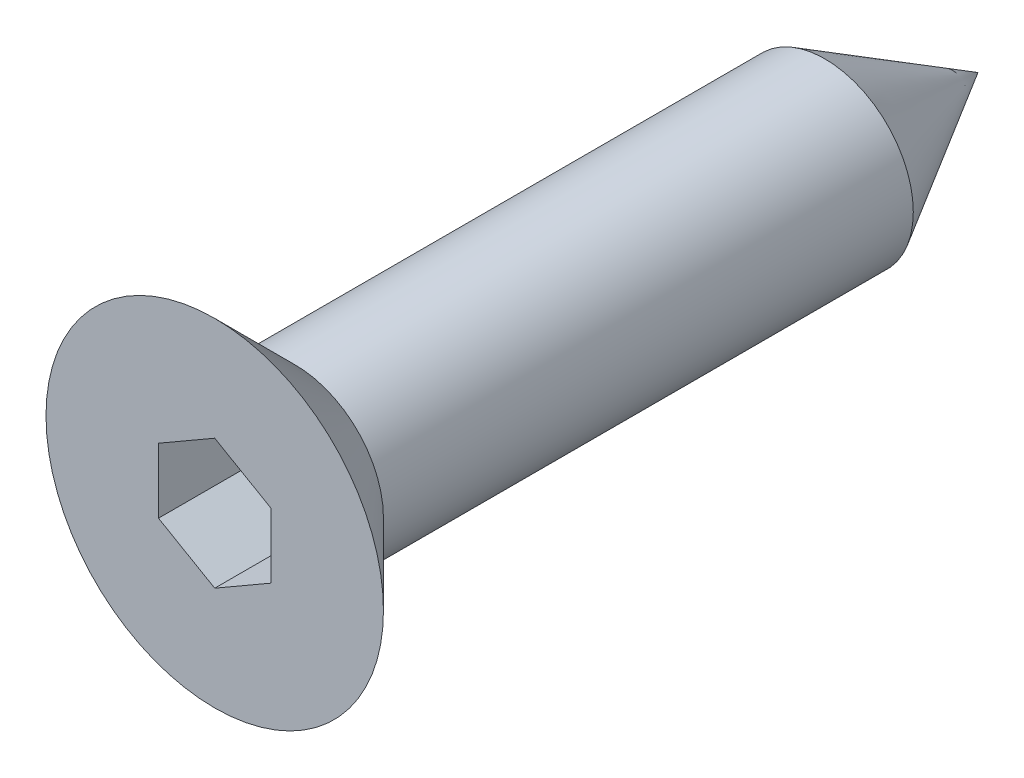
ISO-10303-21;
HEADER;
FILE_DESCRIPTION(('STEP AP214'),'2;1');
FILE_NAME('part.step','',(''),(''),'','','');
FILE_SCHEMA(('AUTOMOTIVE_DESIGN { 1 0 10303 214 1 1 1 1 }'));
ENDSEC;
DATA;
#1=APPLICATION_CONTEXT('core data for automotive mechanical design processes');
#2=APPLICATION_PROTOCOL_DEFINITION('international standard','automotive_design',2000,#1);
#3=PRODUCT_CONTEXT('',#1,'mechanical');
#4=PRODUCT('Part','Part','',(#3));
#5=PRODUCT_RELATED_PRODUCT_CATEGORY('part','',(#4));
#6=PRODUCT_DEFINITION_FORMATION('','',#4);
#7=PRODUCT_DEFINITION_CONTEXT('part definition',#1,'design');
#8=PRODUCT_DEFINITION('design','',#6,#7);
#9=PRODUCT_DEFINITION_SHAPE('','',#8);
#10=(LENGTH_UNIT() NAMED_UNIT(*) SI_UNIT(.MILLI.,.METRE.));
#11=(NAMED_UNIT(*) PLANE_ANGLE_UNIT() SI_UNIT($,.RADIAN.));
#12=(NAMED_UNIT(*) SI_UNIT($,.STERADIAN.) SOLID_ANGLE_UNIT());
#13=UNCERTAINTY_MEASURE_WITH_UNIT(LENGTH_MEASURE(1.E-05),#10,'distance_accuracy_value','');
#14=(GEOMETRIC_REPRESENTATION_CONTEXT(3) GLOBAL_UNCERTAINTY_ASSIGNED_CONTEXT((#13)) GLOBAL_UNIT_ASSIGNED_CONTEXT((#10,
#11,#12)) REPRESENTATION_CONTEXT('',''));
#15=CARTESIAN_POINT('',(0.,0.,0.));
#16=DIRECTION('',(0.,0.,1.));
#17=DIRECTION('',(1.,0.,0.));
#18=AXIS2_PLACEMENT_3D('',#15,#16,#17);
#19=CARTESIAN_POINT('',(0.,2.1,0.));
#20=DIRECTION('',(0.,0.,-1.));
#21=DIRECTION('',(-1.,0.,0.));
#22=AXIS2_PLACEMENT_3D('',#19,#20,#21);
#23=PLANE('',#22);
#24=DIRECTION('',(-0.866025403784438,-0.5,0.));
#25=VECTOR('',#24,1.);
#26=CARTESIAN_POINT('',(0.,0.808290376865476,0.));
#27=LINE('',#26,#25);
#28=CARTESIAN_POINT('',(0.,0.808290376865476,0.));
#29=VERTEX_POINT('',#28);
#30=CARTESIAN_POINT('',(-0.7,0.404145188432738,0.));
#31=VERTEX_POINT('',#30);
#32=EDGE_CURVE('E123',#29,#31,#27,.T.);
#33=ORIENTED_EDGE('',*,*,#32,.F.);
#34=DIRECTION('',(-0.866025403784439,0.5,0.));
#35=VECTOR('',#34,1.);
#36=CARTESIAN_POINT('',(0.699999999999999,0.404145188432739,0.));
#37=LINE('',#36,#35);
#38=CARTESIAN_POINT('',(0.699999999999999,0.404145188432739,0.));
#39=VERTEX_POINT('',#38);
#40=EDGE_CURVE('E53',#39,#29,#37,.T.);
#41=ORIENTED_EDGE('',*,*,#40,.F.);
#42=DIRECTION('',(0.,1.,0.));
#43=VECTOR('',#42,1.);
#44=CARTESIAN_POINT('',(0.7,-0.404145188432738,0.));
#45=LINE('',#44,#43);
#46=CARTESIAN_POINT('',(0.7,-0.404145188432738,0.));
#47=VERTEX_POINT('',#46);
#48=EDGE_CURVE('E109',#47,#39,#45,.T.);
#49=ORIENTED_EDGE('',*,*,#48,.F.);
#50=DIRECTION('',(0.866025403784439,0.5,0.));
#51=VECTOR('',#50,1.);
#52=CARTESIAN_POINT('',(0.,-0.808290376865476,0.));
#53=LINE('',#52,#51);
#54=CARTESIAN_POINT('',(0.,-0.808290376865476,0.));
#55=VERTEX_POINT('',#54);
#56=EDGE_CURVE('E112',#55,#47,#53,.T.);
#57=ORIENTED_EDGE('',*,*,#56,.F.);
#58=DIRECTION('',(0.866025403784439,-0.5,0.));
#59=VECTOR('',#58,1.);
#60=CARTESIAN_POINT('',(-0.7,-0.404145188432738,0.));
#61=LINE('',#60,#59);
#62=CARTESIAN_POINT('',(-0.7,-0.404145188432738,0.));
#63=VERTEX_POINT('',#62);
#64=EDGE_CURVE('E128',#63,#55,#61,.T.);
#65=ORIENTED_EDGE('',*,*,#64,.F.);
#66=DIRECTION('',(0.,-1.,0.));
#67=VECTOR('',#66,1.);
#68=CARTESIAN_POINT('',(-0.7,0.404145188432738,0.));
#69=LINE('',#68,#67);
#70=EDGE_CURVE('E125',#31,#63,#69,.T.);
#71=ORIENTED_EDGE('',*,*,#70,.F.);
#72=EDGE_LOOP('',(#33,#41,#49,#57,#65,#71));
#73=FACE_BOUND('',#72,.T.);
#74=CARTESIAN_POINT('',(0.,0.,0.));
#75=DIRECTION('',(0.,0.,1.));
#76=DIRECTION('',(1.,0.,0.));
#77=AXIS2_PLACEMENT_3D('',#74,#75,#76);
#78=CIRCLE('',#77,2.1);
#79=CARTESIAN_POINT('',(2.1,0.,0.));
#80=VERTEX_POINT('',#79);
#81=EDGE_CURVE('E46',#80,#80,#78,.T.);
#82=ORIENTED_EDGE('',*,*,#81,.T.);
#83=EDGE_LOOP('',(#82));
#84=FACE_BOUND('',#83,.T.);
#85=ADVANCED_FACE('F37',(#73,#84),#23,.F.);
#86=CARTESIAN_POINT('',(0.,0.,-1.));
#87=DIRECTION('',(0.,0.,1.));
#88=DIRECTION('',(1.,0.,0.));
#89=AXIS2_PLACEMENT_3D('',#86,#87,#88);
#90=CONICAL_SURFACE('',#89,1.1,0.785398163397447);
#91=ORIENTED_EDGE('',*,*,#81,.F.);
#92=EDGE_LOOP('',(#91));
#93=FACE_BOUND('',#92,.T.);
#94=CARTESIAN_POINT('',(0.,0.,-1.));
#95=DIRECTION('',(0.,0.,1.));
#96=DIRECTION('',(1.,0.,0.));
#97=AXIS2_PLACEMENT_3D('',#94,#95,#96);
#98=CIRCLE('',#97,1.1);
#99=CARTESIAN_POINT('',(1.1,0.,-1.));
#100=VERTEX_POINT('',#99);
#101=EDGE_CURVE('E135',#100,#100,#98,.T.);
#102=ORIENTED_EDGE('',*,*,#101,.T.);
#103=EDGE_LOOP('',(#102));
#104=FACE_BOUND('',#103,.T.);
#105=ADVANCED_FACE('F148',(#93,#104),#90,.T.);
#106=CARTESIAN_POINT('',(0.,0.,-9.5));
#107=DIRECTION('',(0.,0.,1.));
#108=DIRECTION('',(1.,0.,0.));
#109=AXIS2_PLACEMENT_3D('',#106,#107,#108);
#110=CYLINDRICAL_SURFACE('',#109,1.1);
#111=CARTESIAN_POINT('',(0.,0.,-7.59474411167423));
#112=DIRECTION('',(0.,0.,1.));
#113=DIRECTION('',(1.,0.,0.));
#114=AXIS2_PLACEMENT_3D('',#111,#112,#113);
#115=CIRCLE('',#114,1.1);
#116=CARTESIAN_POINT('',(1.1,0.,-7.59474411167423));
#117=VERTEX_POINT('',#116);
#118=EDGE_CURVE('E11',#117,#117,#115,.T.);
#119=ORIENTED_EDGE('',*,*,#118,.T.);
#120=EDGE_LOOP('',(#119));
#121=FACE_BOUND('',#120,.T.);
#122=ORIENTED_EDGE('',*,*,#101,.F.);
#123=EDGE_LOOP('',(#122));
#124=FACE_BOUND('',#123,.T.);
#125=ADVANCED_FACE('F151',(#121,#124),#110,.T.);
#126=CARTESIAN_POINT('',(0.699999999999999,0.404145188432739,-1.5));
#127=DIRECTION('',(0.5,0.866025403784439,0.));
#128=DIRECTION('',(-0.866025403784439,0.5,0.));
#129=AXIS2_PLACEMENT_3D('',#126,#127,#128);
#130=PLANE('',#129);
#131=ORIENTED_EDGE('',*,*,#40,.T.);
#132=DIRECTION('',(0.,0.,1.));
#133=VECTOR('',#132,1.);
#134=CARTESIAN_POINT('',(0.,0.808290376865476,-1.5));
#135=LINE('',#134,#133);
#136=CARTESIAN_POINT('',(0.,0.808290376865476,-1.5));
#137=VERTEX_POINT('',#136);
#138=EDGE_CURVE('E86',#137,#29,#135,.T.);
#139=ORIENTED_EDGE('',*,*,#138,.F.);
#140=DIRECTION('',(-0.866025403784439,0.5,0.));
#141=VECTOR('',#140,1.);
#142=CARTESIAN_POINT('',(0.699999999999999,0.404145188432739,-1.5));
#143=LINE('',#142,#141);
#144=CARTESIAN_POINT('',(0.699999999999999,0.404145188432739,-1.5));
#145=VERTEX_POINT('',#144);
#146=EDGE_CURVE('E90',#145,#137,#143,.T.);
#147=ORIENTED_EDGE('',*,*,#146,.F.);
#148=DIRECTION('',(0.,0.,1.));
#149=VECTOR('',#148,1.);
#150=CARTESIAN_POINT('',(0.699999999999999,0.404145188432739,-1.5));
#151=LINE('',#150,#149);
#152=EDGE_CURVE('E133',#145,#39,#151,.T.);
#153=ORIENTED_EDGE('',*,*,#152,.T.);
#154=EDGE_LOOP('',(#131,#139,#147,#153));
#155=FACE_BOUND('',#154,.T.);
#156=ADVANCED_FACE('F88',(#155),#130,.F.);
#157=CARTESIAN_POINT('',(0.7,-0.404145188432738,-1.5));
#158=DIRECTION('',(1.,0.,0.));
#159=DIRECTION('',(0.,1.,0.));
#160=AXIS2_PLACEMENT_3D('',#157,#158,#159);
#161=PLANE('',#160);
#162=ORIENTED_EDGE('',*,*,#48,.T.);
#163=ORIENTED_EDGE('',*,*,#152,.F.);
#164=DIRECTION('',(0.,1.,0.));
#165=VECTOR('',#164,1.);
#166=CARTESIAN_POINT('',(0.7,-0.404145188432738,-1.5));
#167=LINE('',#166,#165);
#168=CARTESIAN_POINT('',(0.7,-0.404145188432738,-1.5));
#169=VERTEX_POINT('',#168);
#170=EDGE_CURVE('E96',#169,#145,#167,.T.);
#171=ORIENTED_EDGE('',*,*,#170,.F.);
#172=DIRECTION('',(0.,0.,1.));
#173=VECTOR('',#172,1.);
#174=CARTESIAN_POINT('',(0.7,-0.404145188432738,-1.5));
#175=LINE('',#174,#173);
#176=EDGE_CURVE('E136',#169,#47,#175,.T.);
#177=ORIENTED_EDGE('',*,*,#176,.T.);
#178=EDGE_LOOP('',(#162,#163,#171,#177));
#179=FACE_BOUND('',#178,.T.);
#180=ADVANCED_FACE('F161',(#179),#161,.F.);
#181=CARTESIAN_POINT('',(0.,-0.808290376865476,-1.5));
#182=DIRECTION('',(0.5,-0.866025403784439,0.));
#183=DIRECTION('',(0.866025403784439,0.5,0.));
#184=AXIS2_PLACEMENT_3D('',#181,#182,#183);
#185=PLANE('',#184);
#186=ORIENTED_EDGE('',*,*,#56,.T.);
#187=ORIENTED_EDGE('',*,*,#176,.F.);
#188=DIRECTION('',(0.866025403784439,0.5,0.));
#189=VECTOR('',#188,1.);
#190=CARTESIAN_POINT('',(0.,-0.808290376865476,-1.5));
#191=LINE('',#190,#189);
#192=CARTESIAN_POINT('',(0.,-0.808290376865476,-1.5));
#193=VERTEX_POINT('',#192);
#194=EDGE_CURVE('E119',#193,#169,#191,.T.);
#195=ORIENTED_EDGE('',*,*,#194,.F.);
#196=DIRECTION('',(0.,0.,1.));
#197=VECTOR('',#196,1.);
#198=CARTESIAN_POINT('',(0.,-0.808290376865476,-1.5));
#199=LINE('',#198,#197);
#200=EDGE_CURVE('E138',#193,#55,#199,.T.);
#201=ORIENTED_EDGE('',*,*,#200,.T.);
#202=EDGE_LOOP('',(#186,#187,#195,#201));
#203=FACE_BOUND('',#202,.T.);
#204=ADVANCED_FACE('F178',(#203),#185,.F.);
#205=CARTESIAN_POINT('',(-0.7,-0.404145188432738,-1.5));
#206=DIRECTION('',(-0.5,-0.866025403784439,0.));
#207=DIRECTION('',(0.866025403784439,-0.5,0.));
#208=AXIS2_PLACEMENT_3D('',#205,#206,#207);
#209=PLANE('',#208);
#210=ORIENTED_EDGE('',*,*,#64,.T.);
#211=ORIENTED_EDGE('',*,*,#200,.F.);
#212=DIRECTION('',(0.866025403784439,-0.5,0.));
#213=VECTOR('',#212,1.);
#214=CARTESIAN_POINT('',(-0.7,-0.404145188432738,-1.5));
#215=LINE('',#214,#213);
#216=CARTESIAN_POINT('',(-0.7,-0.404145188432738,-1.5));
#217=VERTEX_POINT('',#216);
#218=EDGE_CURVE('E116',#217,#193,#215,.T.);
#219=ORIENTED_EDGE('',*,*,#218,.F.);
#220=DIRECTION('',(0.,0.,1.));
#221=VECTOR('',#220,1.);
#222=CARTESIAN_POINT('',(-0.7,-0.404145188432738,-1.5));
#223=LINE('',#222,#221);
#224=EDGE_CURVE('E140',#217,#63,#223,.T.);
#225=ORIENTED_EDGE('',*,*,#224,.T.);
#226=EDGE_LOOP('',(#210,#211,#219,#225));
#227=FACE_BOUND('',#226,.T.);
#228=ADVANCED_FACE('F176',(#227),#209,.F.);
#229=CARTESIAN_POINT('',(-0.7,0.404145188432738,-1.5));
#230=DIRECTION('',(-1.,0.,0.));
#231=DIRECTION('',(0.,-1.,0.));
#232=AXIS2_PLACEMENT_3D('',#229,#230,#231);
#233=PLANE('',#232);
#234=ORIENTED_EDGE('',*,*,#70,.T.);
#235=ORIENTED_EDGE('',*,*,#224,.F.);
#236=DIRECTION('',(0.,-1.,0.));
#237=VECTOR('',#236,1.);
#238=CARTESIAN_POINT('',(-0.7,0.404145188432738,-1.5));
#239=LINE('',#238,#237);
#240=CARTESIAN_POINT('',(-0.7,0.404145188432738,-1.5));
#241=VERTEX_POINT('',#240);
#242=EDGE_CURVE('E104',#241,#217,#239,.T.);
#243=ORIENTED_EDGE('',*,*,#242,.F.);
#244=DIRECTION('',(0.,0.,1.));
#245=VECTOR('',#244,1.);
#246=CARTESIAN_POINT('',(-0.7,0.404145188432738,-1.5));
#247=LINE('',#246,#245);
#248=EDGE_CURVE('E95',#241,#31,#247,.T.);
#249=ORIENTED_EDGE('',*,*,#248,.T.);
#250=EDGE_LOOP('',(#234,#235,#243,#249));
#251=FACE_BOUND('',#250,.T.);
#252=ADVANCED_FACE('F172',(#251),#233,.F.);
#253=CARTESIAN_POINT('',(0.,0.808290376865476,-1.5));
#254=DIRECTION('',(-0.5,0.866025403784439,0.));
#255=DIRECTION('',(-0.866025403784439,-0.5,0.));
#256=AXIS2_PLACEMENT_3D('',#253,#254,#255);
#257=PLANE('',#256);
#258=ORIENTED_EDGE('',*,*,#32,.T.);
#259=ORIENTED_EDGE('',*,*,#248,.F.);
#260=DIRECTION('',(-0.866025403784438,-0.5,0.));
#261=VECTOR('',#260,1.);
#262=CARTESIAN_POINT('',(0.,0.808290376865476,-1.5));
#263=LINE('',#262,#261);
#264=EDGE_CURVE('E99',#137,#241,#263,.T.);
#265=ORIENTED_EDGE('',*,*,#264,.F.);
#266=ORIENTED_EDGE('',*,*,#138,.T.);
#267=EDGE_LOOP('',(#258,#259,#265,#266));
#268=FACE_BOUND('',#267,.T.);
#269=ADVANCED_FACE('F100',(#268),#257,.F.);
#270=CARTESIAN_POINT('',(0.,0.808290376865476,-1.5));
#271=DIRECTION('',(0.,0.,1.));
#272=DIRECTION('',(1.,0.,0.));
#273=AXIS2_PLACEMENT_3D('',#270,#271,#272);
#274=PLANE('',#273);
#275=ORIENTED_EDGE('',*,*,#146,.T.);
#276=ORIENTED_EDGE('',*,*,#264,.T.);
#277=ORIENTED_EDGE('',*,*,#242,.T.);
#278=ORIENTED_EDGE('',*,*,#218,.T.);
#279=ORIENTED_EDGE('',*,*,#194,.T.);
#280=ORIENTED_EDGE('',*,*,#170,.T.);
#281=EDGE_LOOP('',(#275,#276,#277,#278,#279,#280));
#282=FACE_BOUND('',#281,.T.);
#283=ADVANCED_FACE('F106',(#282),#274,.T.);
#284=CARTESIAN_POINT('',(0.,0.,-7.59474411167423));
#285=DIRECTION('',(0.,0.,1.));
#286=DIRECTION('',(1.,0.,0.));
#287=AXIS2_PLACEMENT_3D('',#284,#285,#286);
#288=CONICAL_SURFACE('',#287,1.1,0.5235987755983);
#289=CARTESIAN_POINT('',(0.,0.,-9.5));
#290=VERTEX_POINT('',#289);
#291=VERTEX_LOOP('',#290);
#292=FACE_BOUND('',#291,.T.);
#293=ORIENTED_EDGE('',*,*,#118,.F.);
#294=EDGE_LOOP('',(#293));
#295=FACE_BOUND('',#294,.T.);
#296=ADVANCED_FACE('F39',(#292,#295),#288,.T.);
#297=CLOSED_SHELL('',(#85,#105,#125,#156,#180,#204,#228,#252,#269,#283,#296));
#298=MANIFOLD_SOLID_BREP('B2',#297);
#299=ADVANCED_BREP_SHAPE_REPRESENTATION('',(#18,#298),#14);
#300=SHAPE_DEFINITION_REPRESENTATION(#9,#299);
ENDSEC;
END-ISO-10303-21;
